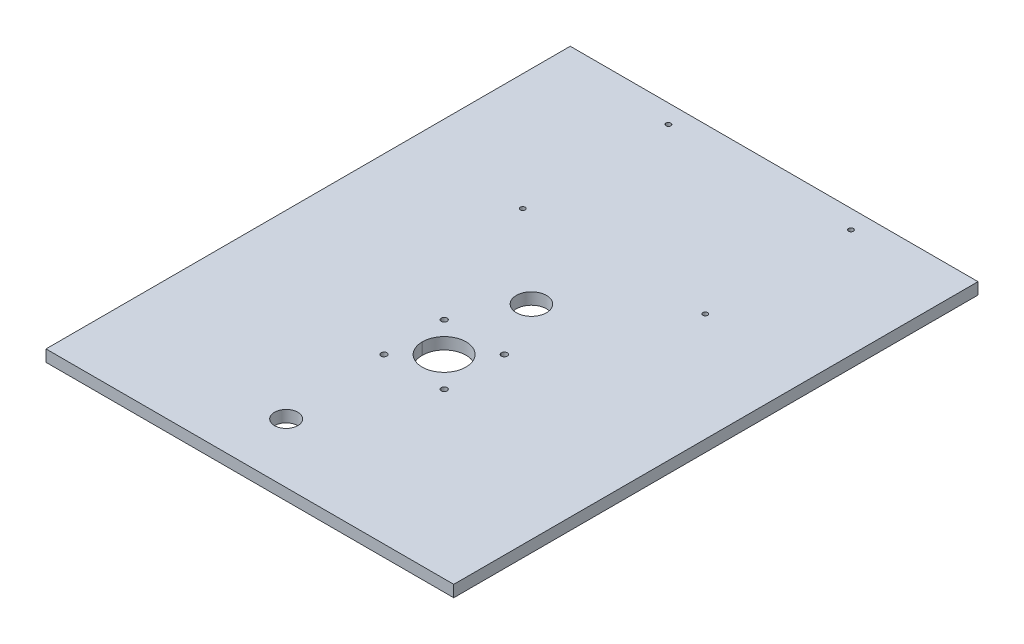
ISO-10303-21;
HEADER;
FILE_DESCRIPTION(('STEP AP214'),'2;1');
FILE_NAME('part.step','',(''),(''),'','','');
FILE_SCHEMA(('AUTOMOTIVE_DESIGN { 1 0 10303 214 1 1 1 1 }'));
ENDSEC;
DATA;
#1=APPLICATION_CONTEXT('core data for automotive mechanical design processes');
#2=APPLICATION_PROTOCOL_DEFINITION('international standard','automotive_design',2000,#1);
#3=PRODUCT_CONTEXT('',#1,'mechanical');
#4=PRODUCT('Part','Part','',(#3));
#5=PRODUCT_RELATED_PRODUCT_CATEGORY('part','',(#4));
#6=PRODUCT_DEFINITION_FORMATION('','',#4);
#7=PRODUCT_DEFINITION_CONTEXT('part definition',#1,'design');
#8=PRODUCT_DEFINITION('design','',#6,#7);
#9=PRODUCT_DEFINITION_SHAPE('','',#8);
#10=(LENGTH_UNIT() NAMED_UNIT(*) SI_UNIT(.MILLI.,.METRE.));
#11=(NAMED_UNIT(*) PLANE_ANGLE_UNIT() SI_UNIT($,.RADIAN.));
#12=(NAMED_UNIT(*) SI_UNIT($,.STERADIAN.) SOLID_ANGLE_UNIT());
#13=UNCERTAINTY_MEASURE_WITH_UNIT(LENGTH_MEASURE(1.E-05),#10,'distance_accuracy_value','');
#14=(GEOMETRIC_REPRESENTATION_CONTEXT(3) GLOBAL_UNCERTAINTY_ASSIGNED_CONTEXT((#13)) GLOBAL_UNIT_ASSIGNED_CONTEXT((#10,
#11,#12)) REPRESENTATION_CONTEXT('',''));
#15=CARTESIAN_POINT('',(0.,0.,0.));
#16=DIRECTION('',(0.,0.,1.));
#17=DIRECTION('',(1.,0.,0.));
#18=AXIS2_PLACEMENT_3D('',#15,#16,#17);
#19=CARTESIAN_POINT('',(0.,6.,0.));
#20=DIRECTION('',(0.,1.,0.));
#21=DIRECTION('',(0.,0.,1.));
#22=AXIS2_PLACEMENT_3D('',#19,#20,#21);
#23=PLANE('',#22);
#24=CARTESIAN_POINT('',(-11.9274601671937,6.,114.387337556772));
#25=DIRECTION('',(0.,1.,0.));
#26=DIRECTION('',(0.,0.,1.));
#27=AXIS2_PLACEMENT_3D('',#24,#25,#26);
#28=CIRCLE('',#27,6.00000000000001);
#29=CARTESIAN_POINT('',(-11.9274601671937,6.,120.387337556772));
#30=VERTEX_POINT('',#29);
#31=EDGE_CURVE('E872',#30,#30,#28,.T.);
#32=ORIENTED_EDGE('',*,*,#31,.F.);
#33=EDGE_LOOP('',(#32));
#34=FACE_BOUND('',#33,.T.);
#35=CARTESIAN_POINT('',(-44.8296663260453,6.,-115.382230576141));
#36=DIRECTION('',(0.,1.,0.));
#37=DIRECTION('',(0.,0.,1.));
#38=AXIS2_PLACEMENT_3D('',#35,#36,#37);
#39=CIRCLE('',#38,1.25);
#40=CARTESIAN_POINT('',(-44.8296663260453,6.,-114.132230576141));
#41=VERTEX_POINT('',#40);
#42=EDGE_CURVE('E238',#41,#41,#39,.T.);
#43=ORIENTED_EDGE('',*,*,#42,.F.);
#44=EDGE_LOOP('',(#43));
#45=FACE_BOUND('',#44,.T.);
#46=CARTESIAN_POINT('',(49.1703336739547,6.,-40.3822305761409));
#47=DIRECTION('',(0.,1.,0.));
#48=DIRECTION('',(0.,0.,1.));
#49=AXIS2_PLACEMENT_3D('',#46,#47,#48);
#50=CIRCLE('',#49,1.25);
#51=CARTESIAN_POINT('',(49.1703336739547,6.,-39.1322305761409));
#52=VERTEX_POINT('',#51);
#53=EDGE_CURVE('E864',#52,#52,#50,.T.);
#54=ORIENTED_EDGE('',*,*,#53,.F.);
#55=EDGE_LOOP('',(#54));
#56=FACE_BOUND('',#55,.T.);
#57=CARTESIAN_POINT('',(-44.8296663260453,6.,-40.3822305761409));
#58=DIRECTION('',(0.,1.,0.));
#59=DIRECTION('',(0.,0.,1.));
#60=AXIS2_PLACEMENT_3D('',#57,#58,#59);
#61=CIRCLE('',#60,1.25);
#62=CARTESIAN_POINT('',(-44.8296663260453,6.,-39.1322305761409));
#63=VERTEX_POINT('',#62);
#64=EDGE_CURVE('E860',#63,#63,#61,.T.);
#65=ORIENTED_EDGE('',*,*,#64,.F.);
#66=EDGE_LOOP('',(#65));
#67=FACE_BOUND('',#66,.T.);
#68=CARTESIAN_POINT('',(49.1703336739547,6.,-115.382230576141));
#69=DIRECTION('',(0.,1.,0.));
#70=DIRECTION('',(0.,0.,1.));
#71=AXIS2_PLACEMENT_3D('',#68,#69,#70);
#72=CIRCLE('',#71,1.25);
#73=CARTESIAN_POINT('',(49.1703336739547,6.,-114.132230576141));
#74=VERTEX_POINT('',#73);
#75=EDGE_CURVE('E857',#74,#74,#72,.T.);
#76=ORIENTED_EDGE('',*,*,#75,.F.);
#77=EDGE_LOOP('',(#76));
#78=FACE_BOUND('',#77,.T.);
#79=CARTESIAN_POINT('',(15.5000221532758,6.,60.4999999999945));
#80=DIRECTION('',(0.,1.,0.));
#81=DIRECTION('',(0.,0.,1.));
#82=AXIS2_PLACEMENT_3D('',#79,#80,#81);
#83=CIRCLE('',#82,1.49999999999999);
#84=CARTESIAN_POINT('',(14.0000221532759,6.,60.4999999999945));
#85=VERTEX_POINT('',#84);
#86=CARTESIAN_POINT('',(17.0000221532759,6.,60.4999999999945));
#87=VERTEX_POINT('',#86);
#88=EDGE_CURVE('E378',#85,#87,#83,.T.);
#89=ORIENTED_EDGE('',*,*,#88,.F.);
#90=DIRECTION('',(8.67361737988379E-13,0.,1.));
#91=VECTOR('',#90,1.);
#92=CARTESIAN_POINT('',(14.0000221532234,6.,-1.21430835466957E-11));
#93=LINE('',#92,#91);
#94=CARTESIAN_POINT('',(14.0000221532758,6.,60.3999999999945));
#95=VERTEX_POINT('',#94);
#96=EDGE_CURVE('E398',#95,#85,#93,.T.);
#97=ORIENTED_EDGE('',*,*,#96,.F.);
#98=CARTESIAN_POINT('',(15.5000221532758,6.,60.3999999999945));
#99=DIRECTION('',(0.,1.,0.));
#100=DIRECTION('',(0.,0.,1.));
#101=AXIS2_PLACEMENT_3D('',#98,#99,#100);
#102=CIRCLE('',#101,1.50000000000003);
#103=CARTESIAN_POINT('',(17.0000221532759,6.,60.3999999999945));
#104=VERTEX_POINT('',#103);
#105=EDGE_CURVE('E402',#104,#95,#102,.T.);
#106=ORIENTED_EDGE('',*,*,#105,.F.);
#107=DIRECTION('',(1.04083408558605E-13,0.,-1.));
#108=VECTOR('',#107,1.);
#109=CARTESIAN_POINT('',(17.0000221532822,6.,1.76942025128541E-12));
#110=LINE('',#109,#108);
#111=EDGE_CURVE('E383',#87,#104,#110,.T.);
#112=ORIENTED_EDGE('',*,*,#111,.F.);
#113=EDGE_LOOP('',(#89,#97,#106,#112));
#114=FACE_BOUND('',#113,.T.);
#115=CARTESIAN_POINT('',(-15.4999931078622,6.,29.5000152611476));
#116=DIRECTION('',(0.,1.,0.));
#117=DIRECTION('',(0.,0.,1.));
#118=AXIS2_PLACEMENT_3D('',#115,#116,#117);
#119=CIRCLE('',#118,1.49999999999996);
#120=CARTESIAN_POINT('',(-16.9999931078615,6.,29.5000167380326));
#121=VERTEX_POINT('',#120);
#122=CARTESIAN_POINT('',(-13.999993107863,6.,29.5000137842625));
#123=VERTEX_POINT('',#122);
#124=EDGE_CURVE('E403',#121,#123,#119,.T.);
#125=ORIENTED_EDGE('',*,*,#124,.F.);
#126=DIRECTION('',(9.84590395325398E-07,0.,0.999999999999515));
#127=VECTOR('',#126,1.);
#128=CARTESIAN_POINT('',(-17.0000221532782,6.,1.67380585324448E-05));
#129=LINE('',#128,#127);
#130=CARTESIAN_POINT('',(-16.9999932063205,6.,29.4000167380327));
#131=VERTEX_POINT('',#130);
#132=EDGE_CURVE('E416',#131,#121,#129,.T.);
#133=ORIENTED_EDGE('',*,*,#132,.F.);
#134=CARTESIAN_POINT('',(-15.4999932063212,6.,29.4000152611476));
#135=DIRECTION('',(0.,1.,0.));
#136=DIRECTION('',(0.,0.,1.));
#137=AXIS2_PLACEMENT_3D('',#134,#135,#136);
#138=CIRCLE('',#137,1.50000000000003);
#139=CARTESIAN_POINT('',(-13.9999932063219,6.,29.4000137842626));
#140=VERTEX_POINT('',#139);
#141=EDGE_CURVE('E420',#140,#131,#138,.T.);
#142=ORIENTED_EDGE('',*,*,#141,.F.);
#143=DIRECTION('',(-9.84588886115974E-07,0.,-0.999999999999515));
#144=VECTOR('',#143,1.);
#145=CARTESIAN_POINT('',(-14.0000221532352,6.,1.37842662174595E-05));
#146=LINE('',#145,#144);
#147=EDGE_CURVE('E432',#123,#140,#146,.T.);
#148=ORIENTED_EDGE('',*,*,#147,.F.);
#149=EDGE_LOOP('',(#125,#133,#142,#148));
#150=FACE_BOUND('',#149,.T.);
#151=CARTESIAN_POINT('',(-15.4999625855711,6.,60.5000152611325));
#152=DIRECTION('',(0.,1.,0.));
#153=DIRECTION('',(0.,0.,1.));
#154=AXIS2_PLACEMENT_3D('',#151,#152,#153);
#155=CIRCLE('',#154,1.5);
#156=CARTESIAN_POINT('',(-16.9999625855704,6.,60.5000167380176));
#157=VERTEX_POINT('',#156);
#158=CARTESIAN_POINT('',(-13.9999625855718,6.,60.5000137842475));
#159=VERTEX_POINT('',#158);
#160=EDGE_CURVE('E421',#157,#159,#155,.T.);
#161=ORIENTED_EDGE('',*,*,#160,.F.);
#162=DIRECTION('',(9.84590083075138E-07,0.,0.999999999999515));
#163=VECTOR('',#162,1.);
#164=CARTESIAN_POINT('',(-17.0000221532704,6.,1.67380532241758E-05));
#165=LINE('',#164,#163);
#166=CARTESIAN_POINT('',(-16.9999626840294,6.,60.4000167380176));
#167=VERTEX_POINT('',#166);
#168=EDGE_CURVE('E442',#167,#157,#165,.T.);
#169=ORIENTED_EDGE('',*,*,#168,.F.);
#170=CARTESIAN_POINT('',(-15.4999626840301,6.,60.4000152611326));
#171=DIRECTION('',(0.,1.,0.));
#172=DIRECTION('',(0.,0.,1.));
#173=AXIS2_PLACEMENT_3D('',#170,#171,#172);
#174=CIRCLE('',#173,1.50000000000004);
#175=CARTESIAN_POINT('',(-13.9999626840308,6.,60.4000137842475));
#176=VERTEX_POINT('',#175);
#177=EDGE_CURVE('E207',#176,#167,#174,.T.);
#178=ORIENTED_EDGE('',*,*,#177,.F.);
#179=DIRECTION('',(-9.8458918101893E-07,0.,-0.999999999999515));
#180=VECTOR('',#179,1.);
#181=CARTESIAN_POINT('',(-14.0000221532173,6.,1.37842703460898E-05));
#182=LINE('',#181,#180);
#183=EDGE_CURVE('E455',#159,#176,#182,.T.);
#184=ORIENTED_EDGE('',*,*,#183,.F.);
#185=EDGE_LOOP('',(#161,#169,#178,#184));
#186=FACE_BOUND('',#185,.T.);
#187=CARTESIAN_POINT('',(2.21532758473867E-05,6.,44.9999999999945));
#188=DIRECTION('',(0.,1.,0.));
#189=DIRECTION('',(0.,0.,1.));
#190=AXIS2_PLACEMENT_3D('',#187,#188,#189);
#191=CIRCLE('',#190,11.25);
#192=CARTESIAN_POINT('',(-11.2499778467228,6.,45.0000055383134));
#193=VERTEX_POINT('',#192);
#194=CARTESIAN_POINT('',(11.2500221532745,6.,44.9999944616755));
#195=VERTEX_POINT('',#194);
#196=EDGE_CURVE('E446',#193,#195,#191,.T.);
#197=ORIENTED_EDGE('',*,*,#196,.F.);
#198=DIRECTION('',(4.92294937454374E-07,0.,0.999999999999879));
#199=VECTOR('',#198,1.);
#200=CARTESIAN_POINT('',(-11.249999999995,6.,5.53831804635991E-06));
#201=LINE('',#200,#199);
#202=CARTESIAN_POINT('',(-11.2499778959523,6.,44.9000055383135));
#203=VERTEX_POINT('',#202);
#204=EDGE_CURVE('E464',#203,#193,#201,.T.);
#205=ORIENTED_EDGE('',*,*,#204,.F.);
#206=CARTESIAN_POINT('',(2.21040463451689E-05,6.,44.8999999999945));
#207=DIRECTION('',(0.,1.,0.));
#208=DIRECTION('',(0.,0.,1.));
#209=AXIS2_PLACEMENT_3D('',#206,#207,#208);
#210=CIRCLE('',#209,11.25);
#211=CARTESIAN_POINT('',(11.250022104045,6.,44.8999944616755));
#212=VERTEX_POINT('',#211);
#213=EDGE_CURVE('E467',#212,#203,#210,.T.);
#214=ORIENTED_EDGE('',*,*,#213,.F.);
#215=DIRECTION('',(-4.92295024190342E-07,0.,-0.999999999999879));
#216=VECTOR('',#215,1.);
#217=CARTESIAN_POINT('',(11.2499999999984,6.,-5.53831902214123E-06));
#218=LINE('',#217,#216);
#219=EDGE_CURVE('E471',#195,#212,#218,.T.);
#220=ORIENTED_EDGE('',*,*,#219,.F.);
#221=EDGE_LOOP('',(#197,#205,#214,#220));
#222=FACE_BOUND('',#221,.T.);
#223=CARTESIAN_POINT('',(15.5000221532758,6.,29.4999999999945));
#224=DIRECTION('',(0.,1.,0.));
#225=DIRECTION('',(0.,0.,1.));
#226=AXIS2_PLACEMENT_3D('',#223,#224,#225);
#227=CIRCLE('',#226,1.49999999999995);
#228=CARTESIAN_POINT('',(14.0000221532759,6.,29.4999999999945));
#229=VERTEX_POINT('',#228);
#230=CARTESIAN_POINT('',(17.0000221532758,6.,29.4999999999945));
#231=VERTEX_POINT('',#230);
#232=EDGE_CURVE('E334',#229,#231,#227,.T.);
#233=ORIENTED_EDGE('',*,*,#232,.F.);
#234=DIRECTION('',(1.12757025938493E-12,0.,1.));
#235=VECTOR('',#234,1.);
#236=CARTESIAN_POINT('',(14.0000221532427,6.,-1.57860086107266E-11));
#237=LINE('',#236,#235);
#238=CARTESIAN_POINT('',(14.0000221532758,6.,29.3999999999945));
#239=VERTEX_POINT('',#238);
#240=EDGE_CURVE('E305',#239,#229,#237,.T.);
#241=ORIENTED_EDGE('',*,*,#240,.F.);
#242=CARTESIAN_POINT('',(15.5000221532758,6.,29.3999999999945));
#243=DIRECTION('',(0.,1.,0.));
#244=DIRECTION('',(0.,0.,1.));
#245=AXIS2_PLACEMENT_3D('',#242,#243,#244);
#246=CIRCLE('',#245,1.50000000000002);
#247=CARTESIAN_POINT('',(17.0000221532759,6.,29.3999999999945));
#248=VERTEX_POINT('',#247);
#249=EDGE_CURVE('E315',#248,#239,#246,.T.);
#250=ORIENTED_EDGE('',*,*,#249,.F.);
#251=DIRECTION('',(4.16333634234436E-13,0.,-1.));
#252=VECTOR('',#251,1.);
#253=CARTESIAN_POINT('',(17.0000221532881,6.,7.07768100514436E-12));
#254=LINE('',#253,#252);
#255=EDGE_CURVE('E331',#231,#248,#254,.T.);
#256=ORIENTED_EDGE('',*,*,#255,.F.);
#257=EDGE_LOOP('',(#233,#241,#250,#256));
#258=FACE_BOUND('',#257,.T.);
#259=DIRECTION('',(0.,0.,1.));
#260=VECTOR('',#259,1.);
#261=CARTESIAN_POINT('',(-105.,6.,-125.));
#262=LINE('',#261,#260);
#263=CARTESIAN_POINT('',(-105.,6.,-125.));
#264=VERTEX_POINT('',#263);
#265=CARTESIAN_POINT('',(-105.,6.,145.));
#266=VERTEX_POINT('',#265);
#267=EDGE_CURVE('E343',#264,#266,#262,.T.);
#268=ORIENTED_EDGE('',*,*,#267,.T.);
#269=DIRECTION('',(1.,0.,0.));
#270=VECTOR('',#269,1.);
#271=CARTESIAN_POINT('',(-105.,6.,145.));
#272=LINE('',#271,#270);
#273=CARTESIAN_POINT('',(105.,6.,145.));
#274=VERTEX_POINT('',#273);
#275=EDGE_CURVE('E348',#266,#274,#272,.T.);
#276=ORIENTED_EDGE('',*,*,#275,.T.);
#277=DIRECTION('',(0.,0.,-1.));
#278=VECTOR('',#277,1.);
#279=CARTESIAN_POINT('',(105.,6.,145.));
#280=LINE('',#279,#278);
#281=CARTESIAN_POINT('',(105.,6.,-125.));
#282=VERTEX_POINT('',#281);
#283=EDGE_CURVE('E355',#274,#282,#280,.T.);
#284=ORIENTED_EDGE('',*,*,#283,.T.);
#285=DIRECTION('',(-1.,0.,0.));
#286=VECTOR('',#285,1.);
#287=CARTESIAN_POINT('',(105.,6.,-125.));
#288=LINE('',#287,#286);
#289=EDGE_CURVE('E360',#282,#264,#288,.T.);
#290=ORIENTED_EDGE('',*,*,#289,.T.);
#291=EDGE_LOOP('',(#268,#276,#284,#290));
#292=FACE_BOUND('',#291,.T.);
#293=CARTESIAN_POINT('',(0.,6.,0.));
#294=DIRECTION('',(0.,1.,0.));
#295=DIRECTION('',(0.,0.,1.));
#296=AXIS2_PLACEMENT_3D('',#293,#294,#295);
#297=CIRCLE('',#296,7.75);
#298=CARTESIAN_POINT('',(0.,6.,7.75));
#299=VERTEX_POINT('',#298);
#300=EDGE_CURVE('E373',#299,#299,#297,.T.);
#301=ORIENTED_EDGE('',*,*,#300,.F.);
#302=EDGE_LOOP('',(#301));
#303=FACE_BOUND('',#302,.T.);
#304=ADVANCED_FACE('F37',(#34,#45,#56,#67,#78,#114,#150,#186,#222,#258,#292,#303),#23,.T.);
#305=CARTESIAN_POINT('',(0.,0.,0.));
#306=DIRECTION('',(0.,1.,0.));
#307=DIRECTION('',(0.,0.,1.));
#308=AXIS2_PLACEMENT_3D('',#305,#306,#307);
#309=PLANE('',#308);
#310=CARTESIAN_POINT('',(-11.9274601671937,0.,114.387337556772));
#311=DIRECTION('',(0.,1.,0.));
#312=DIRECTION('',(0.,0.,1.));
#313=AXIS2_PLACEMENT_3D('',#310,#311,#312);
#314=CIRCLE('',#313,6.00000000000001);
#315=CARTESIAN_POINT('',(-11.9274601671937,0.,120.387337556772));
#316=VERTEX_POINT('',#315);
#317=EDGE_CURVE('E41',#316,#316,#314,.T.);
#318=ORIENTED_EDGE('',*,*,#317,.T.);
#319=EDGE_LOOP('',(#318));
#320=FACE_BOUND('',#319,.T.);
#321=CARTESIAN_POINT('',(-44.8296663260453,0.,-115.382230576141));
#322=DIRECTION('',(0.,-1.,0.));
#323=DIRECTION('',(0.,0.,-1.));
#324=AXIS2_PLACEMENT_3D('',#321,#322,#323);
#325=CIRCLE('',#324,1.25);
#326=CARTESIAN_POINT('',(-44.8296663260453,0.,-116.632230576141));
#327=VERTEX_POINT('',#326);
#328=EDGE_CURVE('E881',#327,#327,#325,.T.);
#329=ORIENTED_EDGE('',*,*,#328,.F.);
#330=EDGE_LOOP('',(#329));
#331=FACE_BOUND('',#330,.T.);
#332=CARTESIAN_POINT('',(49.1703336739547,0.,-40.3822305761409));
#333=DIRECTION('',(0.,-1.,0.));
#334=DIRECTION('',(0.,0.,-1.));
#335=AXIS2_PLACEMENT_3D('',#332,#333,#334);
#336=CIRCLE('',#335,1.25);
#337=CARTESIAN_POINT('',(49.1703336739547,0.,-41.6322305761409));
#338=VERTEX_POINT('',#337);
#339=EDGE_CURVE('E880',#338,#338,#336,.T.);
#340=ORIENTED_EDGE('',*,*,#339,.F.);
#341=EDGE_LOOP('',(#340));
#342=FACE_BOUND('',#341,.T.);
#343=CARTESIAN_POINT('',(-44.8296663260453,0.,-40.3822305761409));
#344=DIRECTION('',(0.,-1.,0.));
#345=DIRECTION('',(0.,0.,-1.));
#346=AXIS2_PLACEMENT_3D('',#343,#344,#345);
#347=CIRCLE('',#346,1.25);
#348=CARTESIAN_POINT('',(-44.8296663260453,0.,-41.6322305761409));
#349=VERTEX_POINT('',#348);
#350=EDGE_CURVE('E875',#349,#349,#347,.T.);
#351=ORIENTED_EDGE('',*,*,#350,.F.);
#352=EDGE_LOOP('',(#351));
#353=FACE_BOUND('',#352,.T.);
#354=CARTESIAN_POINT('',(49.1703336739547,0.,-115.382230576141));
#355=DIRECTION('',(0.,-1.,0.));
#356=DIRECTION('',(0.,0.,-1.));
#357=AXIS2_PLACEMENT_3D('',#354,#355,#356);
#358=CIRCLE('',#357,1.25);
#359=CARTESIAN_POINT('',(49.1703336739547,0.,-116.632230576141));
#360=VERTEX_POINT('',#359);
#361=EDGE_CURVE('E861',#360,#360,#358,.T.);
#362=ORIENTED_EDGE('',*,*,#361,.F.);
#363=EDGE_LOOP('',(#362));
#364=FACE_BOUND('',#363,.T.);
#365=DIRECTION('',(-8.67361737988379E-13,0.,-1.));
#366=VECTOR('',#365,1.);
#367=CARTESIAN_POINT('',(14.0000221532759,0.,60.4999999999945));
#368=LINE('',#367,#366);
#369=CARTESIAN_POINT('',(14.0000221532759,0.,60.4999999999945));
#370=VERTEX_POINT('',#369);
#371=CARTESIAN_POINT('',(14.0000221532758,0.,60.3999999999945));
#372=VERTEX_POINT('',#371);
#373=EDGE_CURVE('E258',#370,#372,#368,.T.);
#374=ORIENTED_EDGE('',*,*,#373,.F.);
#375=CARTESIAN_POINT('',(15.5000221532758,0.,60.4999999999945));
#376=DIRECTION('',(0.,-1.,0.));
#377=DIRECTION('',(0.,0.,-1.));
#378=AXIS2_PLACEMENT_3D('',#375,#376,#377);
#379=CIRCLE('',#378,1.49999999999999);
#380=CARTESIAN_POINT('',(17.0000221532759,0.,60.4999999999945));
#381=VERTEX_POINT('',#380);
#382=EDGE_CURVE('E256',#381,#370,#379,.T.);
#383=ORIENTED_EDGE('',*,*,#382,.F.);
#384=DIRECTION('',(-1.04083408558605E-13,0.,1.));
#385=VECTOR('',#384,1.);
#386=CARTESIAN_POINT('',(17.0000221532759,0.,60.4999999999945));
#387=LINE('',#386,#385);
#388=CARTESIAN_POINT('',(17.0000221532759,0.,60.3999999999945));
#389=VERTEX_POINT('',#388);
#390=EDGE_CURVE('E264',#389,#381,#387,.T.);
#391=ORIENTED_EDGE('',*,*,#390,.F.);
#392=CARTESIAN_POINT('',(15.5000221532758,0.,60.3999999999945));
#393=DIRECTION('',(0.,-1.,0.));
#394=DIRECTION('',(0.,0.,-1.));
#395=AXIS2_PLACEMENT_3D('',#392,#393,#394);
#396=CIRCLE('',#395,1.50000000000003);
#397=EDGE_CURVE('E261',#372,#389,#396,.T.);
#398=ORIENTED_EDGE('',*,*,#397,.F.);
#399=EDGE_LOOP('',(#374,#383,#391,#398));
#400=FACE_BOUND('',#399,.T.);
#401=DIRECTION('',(-9.84590395325398E-07,0.,-0.999999999999515));
#402=VECTOR('',#401,1.);
#403=CARTESIAN_POINT('',(-16.9999931078615,0.,29.5000167380326));
#404=LINE('',#403,#402);
#405=CARTESIAN_POINT('',(-16.9999931078615,0.,29.5000167380326));
#406=VERTEX_POINT('',#405);
#407=CARTESIAN_POINT('',(-16.9999932063205,0.,29.4000167380327));
#408=VERTEX_POINT('',#407);
#409=EDGE_CURVE('E277',#406,#408,#404,.T.);
#410=ORIENTED_EDGE('',*,*,#409,.F.);
#411=CARTESIAN_POINT('',(-15.4999931078622,0.,29.5000152611476));
#412=DIRECTION('',(0.,-1.,0.));
#413=DIRECTION('',(0.,0.,1.));
#414=AXIS2_PLACEMENT_3D('',#411,#412,#413);
#415=CIRCLE('',#414,1.49999999999996);
#416=CARTESIAN_POINT('',(-13.999993107863,0.,29.5000137842625));
#417=VERTEX_POINT('',#416);
#418=EDGE_CURVE('E232',#417,#406,#415,.T.);
#419=ORIENTED_EDGE('',*,*,#418,.F.);
#420=DIRECTION('',(9.84588886115974E-07,0.,0.999999999999515));
#421=VECTOR('',#420,1.);
#422=CARTESIAN_POINT('',(-13.999993107863,0.,29.5000137842625));
#423=LINE('',#422,#421);
#424=CARTESIAN_POINT('',(-13.9999932063219,0.,29.4000137842626));
#425=VERTEX_POINT('',#424);
#426=EDGE_CURVE('E282',#425,#417,#423,.T.);
#427=ORIENTED_EDGE('',*,*,#426,.F.);
#428=CARTESIAN_POINT('',(-15.4999932063212,0.,29.4000152611476));
#429=DIRECTION('',(0.,-1.,0.));
#430=DIRECTION('',(0.,0.,1.));
#431=AXIS2_PLACEMENT_3D('',#428,#429,#430);
#432=CIRCLE('',#431,1.50000000000003);
#433=EDGE_CURVE('E279',#408,#425,#432,.T.);
#434=ORIENTED_EDGE('',*,*,#433,.F.);
#435=EDGE_LOOP('',(#410,#419,#427,#434));
#436=FACE_BOUND('',#435,.T.);
#437=DIRECTION('',(-9.84590083075138E-07,0.,-0.999999999999515));
#438=VECTOR('',#437,1.);
#439=CARTESIAN_POINT('',(-16.9999625855704,0.,60.5000167380176));
#440=LINE('',#439,#438);
#441=CARTESIAN_POINT('',(-16.9999625855704,0.,60.5000167380176));
#442=VERTEX_POINT('',#441);
#443=CARTESIAN_POINT('',(-16.9999626840294,0.,60.4000167380176));
#444=VERTEX_POINT('',#443);
#445=EDGE_CURVE('E215',#442,#444,#440,.T.);
#446=ORIENTED_EDGE('',*,*,#445,.F.);
#447=CARTESIAN_POINT('',(-15.4999625855711,0.,60.5000152611325));
#448=DIRECTION('',(0.,-1.,0.));
#449=DIRECTION('',(0.,0.,1.));
#450=AXIS2_PLACEMENT_3D('',#447,#448,#449);
#451=CIRCLE('',#450,1.5);
#452=CARTESIAN_POINT('',(-13.9999625855718,0.,60.5000137842475));
#453=VERTEX_POINT('',#452);
#454=EDGE_CURVE('E220',#453,#442,#451,.T.);
#455=ORIENTED_EDGE('',*,*,#454,.F.);
#456=DIRECTION('',(9.8458918101893E-07,0.,0.999999999999515));
#457=VECTOR('',#456,1.);
#458=CARTESIAN_POINT('',(-13.9999625855718,0.,60.5000137842475));
#459=LINE('',#458,#457);
#460=CARTESIAN_POINT('',(-13.9999626840308,0.,60.4000137842475));
#461=VERTEX_POINT('',#460);
#462=EDGE_CURVE('E225',#461,#453,#459,.T.);
#463=ORIENTED_EDGE('',*,*,#462,.F.);
#464=CARTESIAN_POINT('',(-15.4999626840301,0.,60.4000152611326));
#465=DIRECTION('',(0.,-1.,0.));
#466=DIRECTION('',(0.,0.,1.));
#467=AXIS2_PLACEMENT_3D('',#464,#465,#466);
#468=CIRCLE('',#467,1.50000000000004);
#469=EDGE_CURVE('E204',#444,#461,#468,.T.);
#470=ORIENTED_EDGE('',*,*,#469,.F.);
#471=EDGE_LOOP('',(#446,#455,#463,#470));
#472=FACE_BOUND('',#471,.T.);
#473=DIRECTION('',(-4.92294937454374E-07,0.,-0.999999999999879));
#474=VECTOR('',#473,1.);
#475=CARTESIAN_POINT('',(-11.2499778467228,0.,45.0000055383134));
#476=LINE('',#475,#474);
#477=CARTESIAN_POINT('',(-11.2499778467228,0.,45.0000055383134));
#478=VERTEX_POINT('',#477);
#479=CARTESIAN_POINT('',(-11.2499778959523,0.,44.9000055383135));
#480=VERTEX_POINT('',#479);
#481=EDGE_CURVE('E237',#478,#480,#476,.T.);
#482=ORIENTED_EDGE('',*,*,#481,.F.);
#483=CARTESIAN_POINT('',(2.21532758473867E-05,0.,44.9999999999945));
#484=DIRECTION('',(0.,-1.,0.));
#485=DIRECTION('',(0.,0.,-1.));
#486=AXIS2_PLACEMENT_3D('',#483,#484,#485);
#487=CIRCLE('',#486,11.25);
#488=CARTESIAN_POINT('',(11.2500221532745,0.,44.9999944616755));
#489=VERTEX_POINT('',#488);
#490=EDGE_CURVE('E235',#489,#478,#487,.T.);
#491=ORIENTED_EDGE('',*,*,#490,.F.);
#492=DIRECTION('',(4.92295024190342E-07,0.,0.999999999999879));
#493=VECTOR('',#492,1.);
#494=CARTESIAN_POINT('',(11.2500221532745,0.,44.9999944616755));
#495=LINE('',#494,#493);
#496=CARTESIAN_POINT('',(11.250022104045,0.,44.8999944616755));
#497=VERTEX_POINT('',#496);
#498=EDGE_CURVE('E244',#497,#489,#495,.T.);
#499=ORIENTED_EDGE('',*,*,#498,.F.);
#500=CARTESIAN_POINT('',(2.21040463451689E-05,0.,44.8999999999945));
#501=DIRECTION('',(0.,-1.,0.));
#502=DIRECTION('',(0.,0.,-1.));
#503=AXIS2_PLACEMENT_3D('',#500,#501,#502);
#504=CIRCLE('',#503,11.25);
#505=EDGE_CURVE('E241',#480,#497,#504,.T.);
#506=ORIENTED_EDGE('',*,*,#505,.F.);
#507=EDGE_LOOP('',(#482,#491,#499,#506));
#508=FACE_BOUND('',#507,.T.);
#509=DIRECTION('',(-1.12757025938493E-12,0.,-1.));
#510=VECTOR('',#509,1.);
#511=CARTESIAN_POINT('',(14.0000221532759,0.,29.4999999999945));
#512=LINE('',#511,#510);
#513=CARTESIAN_POINT('',(14.0000221532759,0.,29.4999999999945));
#514=VERTEX_POINT('',#513);
#515=CARTESIAN_POINT('',(14.0000221532758,0.,29.3999999999945));
#516=VERTEX_POINT('',#515);
#517=EDGE_CURVE('E293',#514,#516,#512,.T.);
#518=ORIENTED_EDGE('',*,*,#517,.F.);
#519=CARTESIAN_POINT('',(15.5000221532758,0.,29.4999999999945));
#520=DIRECTION('',(0.,-1.,0.));
#521=DIRECTION('',(0.,0.,-1.));
#522=AXIS2_PLACEMENT_3D('',#519,#520,#521);
#523=CIRCLE('',#522,1.49999999999995);
#524=CARTESIAN_POINT('',(17.0000221532758,0.,29.4999999999945));
#525=VERTEX_POINT('',#524);
#526=EDGE_CURVE('E270',#525,#514,#523,.T.);
#527=ORIENTED_EDGE('',*,*,#526,.F.);
#528=DIRECTION('',(-4.16333634234436E-13,0.,1.));
#529=VECTOR('',#528,1.);
#530=CARTESIAN_POINT('',(17.0000221532758,0.,29.4999999999945));
#531=LINE('',#530,#529);
#532=CARTESIAN_POINT('',(17.0000221532759,0.,29.3999999999945));
#533=VERTEX_POINT('',#532);
#534=EDGE_CURVE('E299',#533,#525,#531,.T.);
#535=ORIENTED_EDGE('',*,*,#534,.F.);
#536=CARTESIAN_POINT('',(15.5000221532758,0.,29.3999999999945));
#537=DIRECTION('',(0.,-1.,0.));
#538=DIRECTION('',(0.,0.,-1.));
#539=AXIS2_PLACEMENT_3D('',#536,#537,#538);
#540=CIRCLE('',#539,1.50000000000002);
#541=EDGE_CURVE('E296',#516,#533,#540,.T.);
#542=ORIENTED_EDGE('',*,*,#541,.F.);
#543=EDGE_LOOP('',(#518,#527,#535,#542));
#544=FACE_BOUND('',#543,.T.);
#545=DIRECTION('',(0.,0.,1.));
#546=VECTOR('',#545,1.);
#547=CARTESIAN_POINT('',(-105.,0.,-125.));
#548=LINE('',#547,#546);
#549=CARTESIAN_POINT('',(-105.,0.,-125.));
#550=VERTEX_POINT('',#549);
#551=CARTESIAN_POINT('',(-105.,0.,145.));
#552=VERTEX_POINT('',#551);
#553=EDGE_CURVE('E365',#550,#552,#548,.T.);
#554=ORIENTED_EDGE('',*,*,#553,.F.);
#555=DIRECTION('',(-1.,0.,0.));
#556=VECTOR('',#555,1.);
#557=CARTESIAN_POINT('',(105.,0.,-125.));
#558=LINE('',#557,#556);
#559=CARTESIAN_POINT('',(105.,0.,-125.));
#560=VERTEX_POINT('',#559);
#561=EDGE_CURVE('E349',#560,#550,#558,.T.);
#562=ORIENTED_EDGE('',*,*,#561,.F.);
#563=DIRECTION('',(0.,0.,-1.));
#564=VECTOR('',#563,1.);
#565=CARTESIAN_POINT('',(105.,0.,145.));
#566=LINE('',#565,#564);
#567=CARTESIAN_POINT('',(105.,0.,145.));
#568=VERTEX_POINT('',#567);
#569=EDGE_CURVE('E548',#568,#560,#566,.T.);
#570=ORIENTED_EDGE('',*,*,#569,.F.);
#571=DIRECTION('',(1.,0.,0.));
#572=VECTOR('',#571,1.);
#573=CARTESIAN_POINT('',(-105.,0.,145.));
#574=LINE('',#573,#572);
#575=EDGE_CURVE('E540',#552,#568,#574,.T.);
#576=ORIENTED_EDGE('',*,*,#575,.F.);
#577=EDGE_LOOP('',(#554,#562,#570,#576));
#578=FACE_BOUND('',#577,.T.);
#579=CARTESIAN_POINT('',(0.,0.,0.));
#580=DIRECTION('',(0.,1.,0.));
#581=DIRECTION('',(0.,0.,1.));
#582=AXIS2_PLACEMENT_3D('',#579,#580,#581);
#583=CIRCLE('',#582,7.75);
#584=CARTESIAN_POINT('',(0.,0.,7.75));
#585=VERTEX_POINT('',#584);
#586=EDGE_CURVE('E350',#585,#585,#583,.T.);
#587=ORIENTED_EDGE('',*,*,#586,.T.);
#588=EDGE_LOOP('',(#587));
#589=FACE_BOUND('',#588,.T.);
#590=ADVANCED_FACE('F222',(#320,#331,#342,#353,#364,#400,#436,#472,#508,#544,#578,#589),#309,.F.);
#591=CARTESIAN_POINT('',(-105.,6.,-125.));
#592=DIRECTION('',(1.,0.,0.));
#593=DIRECTION('',(0.,0.,-1.));
#594=AXIS2_PLACEMENT_3D('',#591,#592,#593);
#595=PLANE('',#594);
#596=ORIENTED_EDGE('',*,*,#553,.T.);
#597=DIRECTION('',(0.,-1.,0.));
#598=VECTOR('',#597,1.);
#599=CARTESIAN_POINT('',(-105.,6.,145.));
#600=LINE('',#599,#598);
#601=EDGE_CURVE('E12',#266,#552,#600,.T.);
#602=ORIENTED_EDGE('',*,*,#601,.F.);
#603=ORIENTED_EDGE('',*,*,#267,.F.);
#604=DIRECTION('',(0.,-1.,0.));
#605=VECTOR('',#604,1.);
#606=CARTESIAN_POINT('',(-105.,6.,-125.));
#607=LINE('',#606,#605);
#608=EDGE_CURVE('E364',#264,#550,#607,.T.);
#609=ORIENTED_EDGE('',*,*,#608,.T.);
#610=EDGE_LOOP('',(#596,#602,#603,#609));
#611=FACE_BOUND('',#610,.T.);
#612=ADVANCED_FACE('F39',(#611),#595,.F.);
#613=CARTESIAN_POINT('',(-105.,6.,145.));
#614=DIRECTION('',(0.,0.,-1.));
#615=DIRECTION('',(-1.,0.,0.));
#616=AXIS2_PLACEMENT_3D('',#613,#614,#615);
#617=PLANE('',#616);
#618=ORIENTED_EDGE('',*,*,#575,.T.);
#619=DIRECTION('',(0.,-1.,0.));
#620=VECTOR('',#619,1.);
#621=CARTESIAN_POINT('',(105.,6.,145.));
#622=LINE('',#621,#620);
#623=EDGE_CURVE('E46',#274,#568,#622,.T.);
#624=ORIENTED_EDGE('',*,*,#623,.F.);
#625=ORIENTED_EDGE('',*,*,#275,.F.);
#626=ORIENTED_EDGE('',*,*,#601,.T.);
#627=EDGE_LOOP('',(#618,#624,#625,#626));
#628=FACE_BOUND('',#627,.T.);
#629=ADVANCED_FACE('F531',(#628),#617,.F.);
#630=CARTESIAN_POINT('',(105.,6.,145.));
#631=DIRECTION('',(-1.,0.,0.));
#632=DIRECTION('',(0.,0.,1.));
#633=AXIS2_PLACEMENT_3D('',#630,#631,#632);
#634=PLANE('',#633);
#635=ORIENTED_EDGE('',*,*,#569,.T.);
#636=DIRECTION('',(0.,-1.,0.));
#637=VECTOR('',#636,1.);
#638=CARTESIAN_POINT('',(105.,6.,-125.));
#639=LINE('',#638,#637);
#640=EDGE_CURVE('E551',#282,#560,#639,.T.);
#641=ORIENTED_EDGE('',*,*,#640,.F.);
#642=ORIENTED_EDGE('',*,*,#283,.F.);
#643=ORIENTED_EDGE('',*,*,#623,.T.);
#644=EDGE_LOOP('',(#635,#641,#642,#643));
#645=FACE_BOUND('',#644,.T.);
#646=ADVANCED_FACE('F528',(#645),#634,.F.);
#647=CARTESIAN_POINT('',(105.,6.,-125.));
#648=DIRECTION('',(0.,0.,1.));
#649=DIRECTION('',(1.,0.,0.));
#650=AXIS2_PLACEMENT_3D('',#647,#648,#649);
#651=PLANE('',#650);
#652=ORIENTED_EDGE('',*,*,#561,.T.);
#653=ORIENTED_EDGE('',*,*,#608,.F.);
#654=ORIENTED_EDGE('',*,*,#289,.F.);
#655=ORIENTED_EDGE('',*,*,#640,.T.);
#656=EDGE_LOOP('',(#652,#653,#654,#655));
#657=FACE_BOUND('',#656,.T.);
#658=ADVANCED_FACE('F525',(#657),#651,.F.);
#659=CARTESIAN_POINT('',(0.,6.,0.));
#660=DIRECTION('',(0.,-1.,0.));
#661=DIRECTION('',(0.,0.,-1.));
#662=AXIS2_PLACEMENT_3D('',#659,#660,#661);
#663=CYLINDRICAL_SURFACE('',#662,7.75);
#664=ORIENTED_EDGE('',*,*,#300,.T.);
#665=EDGE_LOOP('',(#664));
#666=FACE_BOUND('',#665,.T.);
#667=ORIENTED_EDGE('',*,*,#586,.F.);
#668=EDGE_LOOP('',(#667));
#669=FACE_BOUND('',#668,.T.);
#670=ADVANCED_FACE('F522',(#666,#669),#663,.F.);
#671=CARTESIAN_POINT('',(15.5000221532758,10.,29.4999999999945));
#672=DIRECTION('',(0.,-1.,0.));
#673=DIRECTION('',(0.,0.,-1.));
#674=AXIS2_PLACEMENT_3D('',#671,#672,#673);
#675=CYLINDRICAL_SURFACE('',#674,1.49999999999995);
#676=ORIENTED_EDGE('',*,*,#232,.T.);
#677=DIRECTION('',(0.,-1.,0.));
#678=VECTOR('',#677,1.);
#679=CARTESIAN_POINT('',(17.0000221532758,10.,29.4999999999945));
#680=LINE('',#679,#678);
#681=EDGE_CURVE('E303',#231,#525,#680,.T.);
#682=ORIENTED_EDGE('',*,*,#681,.T.);
#683=ORIENTED_EDGE('',*,*,#526,.T.);
#684=DIRECTION('',(0.,-1.,0.));
#685=VECTOR('',#684,1.);
#686=CARTESIAN_POINT('',(14.0000221532759,10.,29.4999999999945));
#687=LINE('',#686,#685);
#688=EDGE_CURVE('E302',#229,#514,#687,.T.);
#689=ORIENTED_EDGE('',*,*,#688,.F.);
#690=EDGE_LOOP('',(#676,#682,#683,#689));
#691=FACE_BOUND('',#690,.T.);
#692=ADVANCED_FACE('F572',(#691),#675,.F.);
#693=CARTESIAN_POINT('',(17.0000221532758,10.,29.4999999999945));
#694=DIRECTION('',(1.,0.,4.16333634234436E-13));
#695=DIRECTION('',(4.16333634234436E-13,0.,-1.));
#696=AXIS2_PLACEMENT_3D('',#693,#694,#695);
#697=PLANE('',#696);
#698=ORIENTED_EDGE('',*,*,#255,.T.);
#699=DIRECTION('',(0.,-1.,0.));
#700=VECTOR('',#699,1.);
#701=CARTESIAN_POINT('',(17.0000221532759,10.,29.3999999999945));
#702=LINE('',#701,#700);
#703=EDGE_CURVE('E306',#248,#533,#702,.T.);
#704=ORIENTED_EDGE('',*,*,#703,.T.);
#705=ORIENTED_EDGE('',*,*,#534,.T.);
#706=ORIENTED_EDGE('',*,*,#681,.F.);
#707=EDGE_LOOP('',(#698,#704,#705,#706));
#708=FACE_BOUND('',#707,.T.);
#709=ADVANCED_FACE('F576',(#708),#697,.F.);
#710=CARTESIAN_POINT('',(15.5000221532758,10.,29.3999999999945));
#711=DIRECTION('',(0.,-1.,0.));
#712=DIRECTION('',(0.,0.,-1.));
#713=AXIS2_PLACEMENT_3D('',#710,#711,#712);
#714=CYLINDRICAL_SURFACE('',#713,1.50000000000002);
#715=ORIENTED_EDGE('',*,*,#249,.T.);
#716=DIRECTION('',(0.,-1.,0.));
#717=VECTOR('',#716,1.);
#718=CARTESIAN_POINT('',(14.0000221532758,10.,29.3999999999945));
#719=LINE('',#718,#717);
#720=EDGE_CURVE('E308',#239,#516,#719,.T.);
#721=ORIENTED_EDGE('',*,*,#720,.T.);
#722=ORIENTED_EDGE('',*,*,#541,.T.);
#723=ORIENTED_EDGE('',*,*,#703,.F.);
#724=EDGE_LOOP('',(#715,#721,#722,#723));
#725=FACE_BOUND('',#724,.T.);
#726=ADVANCED_FACE('F582',(#725),#714,.F.);
#727=CARTESIAN_POINT('',(14.0000221532759,10.,29.4999999999945));
#728=DIRECTION('',(-1.,0.,1.12757025938493E-12));
#729=DIRECTION('',(1.12757025938493E-12,0.,1.));
#730=AXIS2_PLACEMENT_3D('',#727,#728,#729);
#731=PLANE('',#730);
#732=ORIENTED_EDGE('',*,*,#240,.T.);
#733=ORIENTED_EDGE('',*,*,#688,.T.);
#734=ORIENTED_EDGE('',*,*,#517,.T.);
#735=ORIENTED_EDGE('',*,*,#720,.F.);
#736=EDGE_LOOP('',(#732,#733,#734,#735));
#737=FACE_BOUND('',#736,.T.);
#738=ADVANCED_FACE('F508',(#737),#731,.F.);
#739=CARTESIAN_POINT('',(2.21532758473867E-05,10.,44.9999999999945));
#740=DIRECTION('',(0.,-1.,0.));
#741=DIRECTION('',(0.,0.,-1.));
#742=AXIS2_PLACEMENT_3D('',#739,#740,#741);
#743=CYLINDRICAL_SURFACE('',#742,11.25);
#744=ORIENTED_EDGE('',*,*,#196,.T.);
#745=DIRECTION('',(0.,-1.,0.));
#746=VECTOR('',#745,1.);
#747=CARTESIAN_POINT('',(11.2500221532745,10.,44.9999944616755));
#748=LINE('',#747,#746);
#749=EDGE_CURVE('E248',#195,#489,#748,.T.);
#750=ORIENTED_EDGE('',*,*,#749,.T.);
#751=ORIENTED_EDGE('',*,*,#490,.T.);
#752=DIRECTION('',(0.,-1.,0.));
#753=VECTOR('',#752,1.);
#754=CARTESIAN_POINT('',(-11.2499778467228,10.,45.0000055383134));
#755=LINE('',#754,#753);
#756=EDGE_CURVE('E247',#193,#478,#755,.T.);
#757=ORIENTED_EDGE('',*,*,#756,.F.);
#758=EDGE_LOOP('',(#744,#750,#751,#757));
#759=FACE_BOUND('',#758,.T.);
#760=ADVANCED_FACE('F495',(#759),#743,.F.);
#761=CARTESIAN_POINT('',(11.2500221532745,10.,44.9999944616755));
#762=DIRECTION('',(0.999999999999879,0.,-4.92295024190342E-07));
#763=DIRECTION('',(-4.92295024190342E-07,0.,-0.999999999999879));
#764=AXIS2_PLACEMENT_3D('',#761,#762,#763);
#765=PLANE('',#764);
#766=ORIENTED_EDGE('',*,*,#219,.T.);
#767=DIRECTION('',(0.,-1.,0.));
#768=VECTOR('',#767,1.);
#769=CARTESIAN_POINT('',(11.250022104045,10.,44.8999944616755));
#770=LINE('',#769,#768);
#771=EDGE_CURVE('E250',#212,#497,#770,.T.);
#772=ORIENTED_EDGE('',*,*,#771,.T.);
#773=ORIENTED_EDGE('',*,*,#498,.T.);
#774=ORIENTED_EDGE('',*,*,#749,.F.);
#775=EDGE_LOOP('',(#766,#772,#773,#774));
#776=FACE_BOUND('',#775,.T.);
#777=ADVANCED_FACE('F500',(#776),#765,.F.);
#778=CARTESIAN_POINT('',(2.21040463451689E-05,10.,44.8999999999945));
#779=DIRECTION('',(0.,-1.,0.));
#780=DIRECTION('',(0.,0.,-1.));
#781=AXIS2_PLACEMENT_3D('',#778,#779,#780);
#782=CYLINDRICAL_SURFACE('',#781,11.25);
#783=ORIENTED_EDGE('',*,*,#213,.T.);
#784=DIRECTION('',(0.,-1.,0.));
#785=VECTOR('',#784,1.);
#786=CARTESIAN_POINT('',(-11.2499778959523,10.,44.9000055383135));
#787=LINE('',#786,#785);
#788=EDGE_CURVE('E252',#203,#480,#787,.T.);
#789=ORIENTED_EDGE('',*,*,#788,.T.);
#790=ORIENTED_EDGE('',*,*,#505,.T.);
#791=ORIENTED_EDGE('',*,*,#771,.F.);
#792=EDGE_LOOP('',(#783,#789,#790,#791));
#793=FACE_BOUND('',#792,.T.);
#794=ADVANCED_FACE('F486',(#793),#782,.F.);
#795=CARTESIAN_POINT('',(-11.2499778467228,10.,45.0000055383134));
#796=DIRECTION('',(-0.999999999999879,0.,4.92294937454374E-07));
#797=DIRECTION('',(4.92294937454374E-07,0.,0.999999999999879));
#798=AXIS2_PLACEMENT_3D('',#795,#796,#797);
#799=PLANE('',#798);
#800=ORIENTED_EDGE('',*,*,#204,.T.);
#801=ORIENTED_EDGE('',*,*,#756,.T.);
#802=ORIENTED_EDGE('',*,*,#481,.T.);
#803=ORIENTED_EDGE('',*,*,#788,.F.);
#804=EDGE_LOOP('',(#800,#801,#802,#803));
#805=FACE_BOUND('',#804,.T.);
#806=ADVANCED_FACE('F492',(#805),#799,.F.);
#807=CARTESIAN_POINT('',(-15.4999625855711,10.,60.5000152611325));
#808=DIRECTION('',(0.,-1.,0.));
#809=DIRECTION('',(0.,0.,-1.));
#810=AXIS2_PLACEMENT_3D('',#807,#808,#809);
#811=CYLINDRICAL_SURFACE('',#810,1.5);
#812=ORIENTED_EDGE('',*,*,#160,.T.);
#813=DIRECTION('',(0.,-1.,0.));
#814=VECTOR('',#813,1.);
#815=CARTESIAN_POINT('',(-13.9999625855718,10.,60.5000137842475));
#816=LINE('',#815,#814);
#817=EDGE_CURVE('E230',#159,#453,#816,.T.);
#818=ORIENTED_EDGE('',*,*,#817,.T.);
#819=ORIENTED_EDGE('',*,*,#454,.T.);
#820=DIRECTION('',(0.,-1.,0.));
#821=VECTOR('',#820,1.);
#822=CARTESIAN_POINT('',(-16.9999625855704,10.,60.5000167380176));
#823=LINE('',#822,#821);
#824=EDGE_CURVE('E211',#157,#442,#823,.T.);
#825=ORIENTED_EDGE('',*,*,#824,.F.);
#826=EDGE_LOOP('',(#812,#818,#819,#825));
#827=FACE_BOUND('',#826,.T.);
#828=ADVANCED_FACE('F756',(#827),#811,.F.);
#829=CARTESIAN_POINT('',(-13.9999625855718,10.,60.5000137842475));
#830=DIRECTION('',(0.999999999999515,0.,-9.8458918101893E-07));
#831=DIRECTION('',(-9.8458918101893E-07,0.,-0.999999999999515));
#832=AXIS2_PLACEMENT_3D('',#829,#830,#831);
#833=PLANE('',#832);
#834=ORIENTED_EDGE('',*,*,#183,.T.);
#835=DIRECTION('',(0.,-1.,0.));
#836=VECTOR('',#835,1.);
#837=CARTESIAN_POINT('',(-13.9999626840308,10.,60.4000137842475));
#838=LINE('',#837,#836);
#839=EDGE_CURVE('E210',#176,#461,#838,.T.);
#840=ORIENTED_EDGE('',*,*,#839,.T.);
#841=ORIENTED_EDGE('',*,*,#462,.T.);
#842=ORIENTED_EDGE('',*,*,#817,.F.);
#843=EDGE_LOOP('',(#834,#840,#841,#842));
#844=FACE_BOUND('',#843,.T.);
#845=ADVANCED_FACE('F749',(#844),#833,.F.);
#846=CARTESIAN_POINT('',(-15.4999626840301,10.,60.4000152611326));
#847=DIRECTION('',(0.,-1.,0.));
#848=DIRECTION('',(0.,0.,-1.));
#849=AXIS2_PLACEMENT_3D('',#846,#847,#848);
#850=CYLINDRICAL_SURFACE('',#849,1.50000000000004);
#851=ORIENTED_EDGE('',*,*,#177,.T.);
#852=DIRECTION('',(0.,-1.,0.));
#853=VECTOR('',#852,1.);
#854=CARTESIAN_POINT('',(-16.9999626840294,10.,60.4000167380176));
#855=LINE('',#854,#853);
#856=EDGE_CURVE('E199',#167,#444,#855,.T.);
#857=ORIENTED_EDGE('',*,*,#856,.T.);
#858=ORIENTED_EDGE('',*,*,#469,.T.);
#859=ORIENTED_EDGE('',*,*,#839,.F.);
#860=EDGE_LOOP('',(#851,#857,#858,#859));
#861=FACE_BOUND('',#860,.T.);
#862=ADVANCED_FACE('F201',(#861),#850,.F.);
#863=CARTESIAN_POINT('',(-16.9999625855704,10.,60.5000167380176));
#864=DIRECTION('',(-0.999999999999515,0.,9.84590083075138E-07));
#865=DIRECTION('',(9.84590083075138E-07,0.,0.999999999999515));
#866=AXIS2_PLACEMENT_3D('',#863,#864,#865);
#867=PLANE('',#866);
#868=ORIENTED_EDGE('',*,*,#168,.T.);
#869=ORIENTED_EDGE('',*,*,#824,.T.);
#870=ORIENTED_EDGE('',*,*,#445,.T.);
#871=ORIENTED_EDGE('',*,*,#856,.F.);
#872=EDGE_LOOP('',(#868,#869,#870,#871));
#873=FACE_BOUND('',#872,.T.);
#874=ADVANCED_FACE('F216',(#873),#867,.F.);
#875=CARTESIAN_POINT('',(-15.4999931078622,10.,29.5000152611476));
#876=DIRECTION('',(0.,-1.,0.));
#877=DIRECTION('',(0.,0.,-1.));
#878=AXIS2_PLACEMENT_3D('',#875,#876,#877);
#879=CYLINDRICAL_SURFACE('',#878,1.49999999999996);
#880=ORIENTED_EDGE('',*,*,#124,.T.);
#881=DIRECTION('',(0.,-1.,0.));
#882=VECTOR('',#881,1.);
#883=CARTESIAN_POINT('',(-13.999993107863,10.,29.5000137842625));
#884=LINE('',#883,#882);
#885=EDGE_CURVE('E259',#123,#417,#884,.T.);
#886=ORIENTED_EDGE('',*,*,#885,.T.);
#887=ORIENTED_EDGE('',*,*,#418,.T.);
#888=DIRECTION('',(0.,-1.,0.));
#889=VECTOR('',#888,1.);
#890=CARTESIAN_POINT('',(-16.9999931078615,10.,29.5000167380326));
#891=LINE('',#890,#889);
#892=EDGE_CURVE('E285',#121,#406,#891,.T.);
#893=ORIENTED_EDGE('',*,*,#892,.F.);
#894=EDGE_LOOP('',(#880,#886,#887,#893));
#895=FACE_BOUND('',#894,.T.);
#896=ADVANCED_FACE('F728',(#895),#879,.F.);
#897=CARTESIAN_POINT('',(-13.999993107863,10.,29.5000137842625));
#898=DIRECTION('',(0.999999999999515,0.,-9.84588886115974E-07));
#899=DIRECTION('',(-9.84588886115974E-07,0.,-0.999999999999515));
#900=AXIS2_PLACEMENT_3D('',#897,#898,#899);
#901=PLANE('',#900);
#902=ORIENTED_EDGE('',*,*,#147,.T.);
#903=DIRECTION('',(0.,-1.,0.));
#904=VECTOR('',#903,1.);
#905=CARTESIAN_POINT('',(-13.9999932063219,10.,29.4000137842626));
#906=LINE('',#905,#904);
#907=EDGE_CURVE('E287',#140,#425,#906,.T.);
#908=ORIENTED_EDGE('',*,*,#907,.T.);
#909=ORIENTED_EDGE('',*,*,#426,.T.);
#910=ORIENTED_EDGE('',*,*,#885,.F.);
#911=EDGE_LOOP('',(#902,#908,#909,#910));
#912=FACE_BOUND('',#911,.T.);
#913=ADVANCED_FACE('F720',(#912),#901,.F.);
#914=CARTESIAN_POINT('',(-15.4999932063212,10.,29.4000152611476));
#915=DIRECTION('',(0.,-1.,0.));
#916=DIRECTION('',(0.,0.,-1.));
#917=AXIS2_PLACEMENT_3D('',#914,#915,#916);
#918=CYLINDRICAL_SURFACE('',#917,1.50000000000003);
#919=ORIENTED_EDGE('',*,*,#141,.T.);
#920=DIRECTION('',(0.,-1.,0.));
#921=VECTOR('',#920,1.);
#922=CARTESIAN_POINT('',(-16.9999932063205,10.,29.4000167380327));
#923=LINE('',#922,#921);
#924=EDGE_CURVE('E61',#131,#408,#923,.T.);
#925=ORIENTED_EDGE('',*,*,#924,.T.);
#926=ORIENTED_EDGE('',*,*,#433,.T.);
#927=ORIENTED_EDGE('',*,*,#907,.F.);
#928=EDGE_LOOP('',(#919,#925,#926,#927));
#929=FACE_BOUND('',#928,.T.);
#930=ADVANCED_FACE('F713',(#929),#918,.F.);
#931=CARTESIAN_POINT('',(-16.9999931078615,10.,29.5000167380326));
#932=DIRECTION('',(-0.999999999999515,0.,9.84590395325398E-07));
#933=DIRECTION('',(9.84590395325398E-07,0.,0.999999999999515));
#934=AXIS2_PLACEMENT_3D('',#931,#932,#933);
#935=PLANE('',#934);
#936=ORIENTED_EDGE('',*,*,#132,.T.);
#937=ORIENTED_EDGE('',*,*,#892,.T.);
#938=ORIENTED_EDGE('',*,*,#409,.T.);
#939=ORIENTED_EDGE('',*,*,#924,.F.);
#940=EDGE_LOOP('',(#936,#937,#938,#939));
#941=FACE_BOUND('',#940,.T.);
#942=ADVANCED_FACE('F705',(#941),#935,.F.);
#943=CARTESIAN_POINT('',(15.5000221532758,10.,60.4999999999945));
#944=DIRECTION('',(0.,-1.,0.));
#945=DIRECTION('',(0.,0.,-1.));
#946=AXIS2_PLACEMENT_3D('',#943,#944,#945);
#947=CYLINDRICAL_SURFACE('',#946,1.49999999999999);
#948=ORIENTED_EDGE('',*,*,#88,.T.);
#949=DIRECTION('',(0.,-1.,0.));
#950=VECTOR('',#949,1.);
#951=CARTESIAN_POINT('',(17.0000221532759,10.,60.4999999999945));
#952=LINE('',#951,#950);
#953=EDGE_CURVE('E268',#87,#381,#952,.T.);
#954=ORIENTED_EDGE('',*,*,#953,.T.);
#955=ORIENTED_EDGE('',*,*,#382,.T.);
#956=DIRECTION('',(0.,-1.,0.));
#957=VECTOR('',#956,1.);
#958=CARTESIAN_POINT('',(14.0000221532759,10.,60.4999999999945));
#959=LINE('',#958,#957);
#960=EDGE_CURVE('E267',#85,#370,#959,.T.);
#961=ORIENTED_EDGE('',*,*,#960,.F.);
#962=EDGE_LOOP('',(#948,#954,#955,#961));
#963=FACE_BOUND('',#962,.T.);
#964=ADVANCED_FACE('F697',(#963),#947,.F.);
#965=CARTESIAN_POINT('',(17.0000221532759,10.,60.4999999999945));
#966=DIRECTION('',(1.,0.,1.04083408558605E-13));
#967=DIRECTION('',(1.04083408558605E-13,0.,-1.));
#968=AXIS2_PLACEMENT_3D('',#965,#966,#967);
#969=PLANE('',#968);
#970=ORIENTED_EDGE('',*,*,#111,.T.);
#971=DIRECTION('',(0.,-1.,0.));
#972=VECTOR('',#971,1.);
#973=CARTESIAN_POINT('',(17.0000221532759,10.,60.3999999999945));
#974=LINE('',#973,#972);
#975=EDGE_CURVE('E271',#104,#389,#974,.T.);
#976=ORIENTED_EDGE('',*,*,#975,.T.);
#977=ORIENTED_EDGE('',*,*,#390,.T.);
#978=ORIENTED_EDGE('',*,*,#953,.F.);
#979=EDGE_LOOP('',(#970,#976,#977,#978));
#980=FACE_BOUND('',#979,.T.);
#981=ADVANCED_FACE('F689',(#980),#969,.F.);
#982=CARTESIAN_POINT('',(15.5000221532758,10.,60.3999999999945));
#983=DIRECTION('',(0.,-1.,0.));
#984=DIRECTION('',(0.,0.,-1.));
#985=AXIS2_PLACEMENT_3D('',#982,#983,#984);
#986=CYLINDRICAL_SURFACE('',#985,1.50000000000003);
#987=ORIENTED_EDGE('',*,*,#105,.T.);
#988=DIRECTION('',(0.,-1.,0.));
#989=VECTOR('',#988,1.);
#990=CARTESIAN_POINT('',(14.0000221532758,10.,60.3999999999945));
#991=LINE('',#990,#989);
#992=EDGE_CURVE('E53',#95,#372,#991,.T.);
#993=ORIENTED_EDGE('',*,*,#992,.T.);
#994=ORIENTED_EDGE('',*,*,#397,.T.);
#995=ORIENTED_EDGE('',*,*,#975,.F.);
#996=EDGE_LOOP('',(#987,#993,#994,#995));
#997=FACE_BOUND('',#996,.T.);
#998=ADVANCED_FACE('F682',(#997),#986,.F.);
#999=CARTESIAN_POINT('',(14.0000221532759,10.,60.4999999999945));
#1000=DIRECTION('',(-1.,0.,8.67361737988379E-13));
#1001=DIRECTION('',(8.67361737988379E-13,0.,1.));
#1002=AXIS2_PLACEMENT_3D('',#999,#1000,#1001);
#1003=PLANE('',#1002);
#1004=ORIENTED_EDGE('',*,*,#96,.T.);
#1005=ORIENTED_EDGE('',*,*,#960,.T.);
#1006=ORIENTED_EDGE('',*,*,#373,.T.);
#1007=ORIENTED_EDGE('',*,*,#992,.F.);
#1008=EDGE_LOOP('',(#1004,#1005,#1006,#1007));
#1009=FACE_BOUND('',#1008,.T.);
#1010=ADVANCED_FACE('F674',(#1009),#1003,.F.);
#1011=CARTESIAN_POINT('',(49.1703336739547,10.,-115.382230576141));
#1012=DIRECTION('',(0.,-1.,0.));
#1013=DIRECTION('',(0.,0.,-1.));
#1014=AXIS2_PLACEMENT_3D('',#1011,#1012,#1013);
#1015=CYLINDRICAL_SURFACE('',#1014,1.25);
#1016=ORIENTED_EDGE('',*,*,#75,.T.);
#1017=EDGE_LOOP('',(#1016));
#1018=FACE_BOUND('',#1017,.T.);
#1019=ORIENTED_EDGE('',*,*,#361,.T.);
#1020=EDGE_LOOP('',(#1019));
#1021=FACE_BOUND('',#1020,.T.);
#1022=ADVANCED_FACE('F666',(#1018,#1021),#1015,.F.);
#1023=CARTESIAN_POINT('',(-44.8296663260453,10.,-40.3822305761409));
#1024=DIRECTION('',(0.,-1.,0.));
#1025=DIRECTION('',(0.,0.,-1.));
#1026=AXIS2_PLACEMENT_3D('',#1023,#1024,#1025);
#1027=CYLINDRICAL_SURFACE('',#1026,1.25);
#1028=ORIENTED_EDGE('',*,*,#64,.T.);
#1029=EDGE_LOOP('',(#1028));
#1030=FACE_BOUND('',#1029,.T.);
#1031=ORIENTED_EDGE('',*,*,#350,.T.);
#1032=EDGE_LOOP('',(#1031));
#1033=FACE_BOUND('',#1032,.T.);
#1034=ADVANCED_FACE('F658',(#1030,#1033),#1027,.F.);
#1035=CARTESIAN_POINT('',(49.1703336739547,10.,-40.3822305761409));
#1036=DIRECTION('',(0.,-1.,0.));
#1037=DIRECTION('',(0.,0.,-1.));
#1038=AXIS2_PLACEMENT_3D('',#1035,#1036,#1037);
#1039=CYLINDRICAL_SURFACE('',#1038,1.25);
#1040=ORIENTED_EDGE('',*,*,#53,.T.);
#1041=EDGE_LOOP('',(#1040));
#1042=FACE_BOUND('',#1041,.T.);
#1043=ORIENTED_EDGE('',*,*,#339,.T.);
#1044=EDGE_LOOP('',(#1043));
#1045=FACE_BOUND('',#1044,.T.);
#1046=ADVANCED_FACE('F651',(#1042,#1045),#1039,.F.);
#1047=CARTESIAN_POINT('',(-44.8296663260453,10.,-115.382230576141));
#1048=DIRECTION('',(0.,-1.,0.));
#1049=DIRECTION('',(0.,0.,-1.));
#1050=AXIS2_PLACEMENT_3D('',#1047,#1048,#1049);
#1051=CYLINDRICAL_SURFACE('',#1050,1.25);
#1052=ORIENTED_EDGE('',*,*,#42,.T.);
#1053=EDGE_LOOP('',(#1052));
#1054=FACE_BOUND('',#1053,.T.);
#1055=ORIENTED_EDGE('',*,*,#328,.T.);
#1056=EDGE_LOOP('',(#1055));
#1057=FACE_BOUND('',#1056,.T.);
#1058=ADVANCED_FACE('F641',(#1054,#1057),#1051,.F.);
#1059=CARTESIAN_POINT('',(-11.9274601671937,-4.,114.387337556772));
#1060=DIRECTION('',(0.,1.,0.));
#1061=DIRECTION('',(0.,0.,1.));
#1062=AXIS2_PLACEMENT_3D('',#1059,#1060,#1061);
#1063=CYLINDRICAL_SURFACE('',#1062,6.00000000000001);
#1064=ORIENTED_EDGE('',*,*,#31,.T.);
#1065=EDGE_LOOP('',(#1064));
#1066=FACE_BOUND('',#1065,.T.);
#1067=ORIENTED_EDGE('',*,*,#317,.F.);
#1068=EDGE_LOOP('',(#1067));
#1069=FACE_BOUND('',#1068,.T.);
#1070=ADVANCED_FACE('F637',(#1066,#1069),#1063,.F.);
#1071=CLOSED_SHELL('',(#304,#590,#612,#629,#646,#658,#670,#692,#709,#726,#738,#760,#777,#794,
#806,#828,#845,#862,#874,#896,#913,#930,#942,#964,#981,#998,#1010,#1022,#1034,#1046,#1058,#1070));
#1072=MANIFOLD_SOLID_BREP('B2',#1071);
#1073=ADVANCED_BREP_SHAPE_REPRESENTATION('',(#18,#1072),#14);
#1074=SHAPE_DEFINITION_REPRESENTATION(#9,#1073);
ENDSEC;
END-ISO-10303-21;
